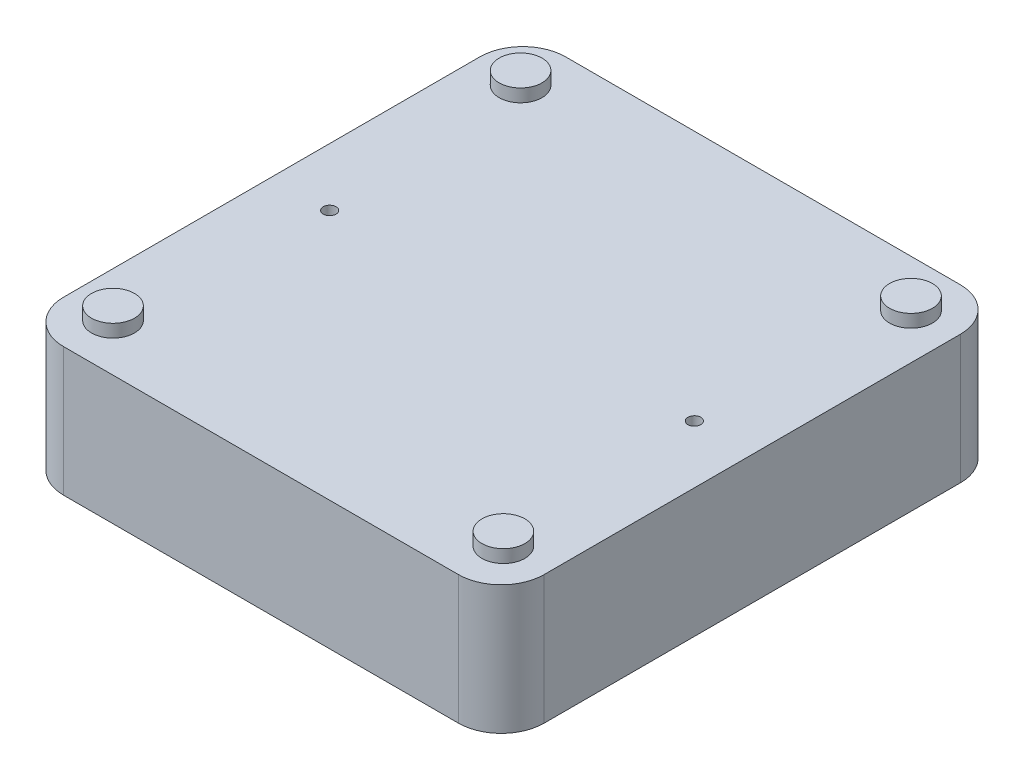
ISO-10303-21;
HEADER;
FILE_DESCRIPTION(('STEP AP214'),'2;1');
FILE_NAME('part.step','',(''),(''),'','','');
FILE_SCHEMA(('AUTOMOTIVE_DESIGN { 1 0 10303 214 1 1 1 1 }'));
ENDSEC;
DATA;
#1=APPLICATION_CONTEXT('core data for automotive mechanical design processes');
#2=APPLICATION_PROTOCOL_DEFINITION('international standard','automotive_design',2000,#1);
#3=PRODUCT_CONTEXT('',#1,'mechanical');
#4=PRODUCT('Part','Part','',(#3));
#5=PRODUCT_RELATED_PRODUCT_CATEGORY('part','',(#4));
#6=PRODUCT_DEFINITION_FORMATION('','',#4);
#7=PRODUCT_DEFINITION_CONTEXT('part definition',#1,'design');
#8=PRODUCT_DEFINITION('design','',#6,#7);
#9=PRODUCT_DEFINITION_SHAPE('','',#8);
#10=(LENGTH_UNIT() NAMED_UNIT(*) SI_UNIT(.MILLI.,.METRE.));
#11=(NAMED_UNIT(*) PLANE_ANGLE_UNIT() SI_UNIT($,.RADIAN.));
#12=(NAMED_UNIT(*) SI_UNIT($,.STERADIAN.) SOLID_ANGLE_UNIT());
#13=UNCERTAINTY_MEASURE_WITH_UNIT(LENGTH_MEASURE(1.E-05),#10,'distance_accuracy_value','');
#14=(GEOMETRIC_REPRESENTATION_CONTEXT(3) GLOBAL_UNCERTAINTY_ASSIGNED_CONTEXT((#13)) GLOBAL_UNIT_ASSIGNED_CONTEXT((#10,
#11,#12)) REPRESENTATION_CONTEXT('',''));
#15=CARTESIAN_POINT('',(0.,0.,0.));
#16=DIRECTION('',(0.,0.,1.));
#17=DIRECTION('',(1.,0.,0.));
#18=AXIS2_PLACEMENT_3D('',#15,#16,#17);
#19=CARTESIAN_POINT('',(56.,30.,58.5));
#20=DIRECTION('',(-1.,0.,0.));
#21=DIRECTION('',(0.,0.,1.));
#22=AXIS2_PLACEMENT_3D('',#19,#20,#21);
#23=PLANE('',#22);
#24=DIRECTION('',(0.,0.,-1.));
#25=VECTOR('',#24,1.);
#26=CARTESIAN_POINT('',(56.,0.,58.5));
#27=LINE('',#26,#25);
#28=CARTESIAN_POINT('',(56.,0.,48.5));
#29=VERTEX_POINT('',#28);
#30=CARTESIAN_POINT('',(56.,0.,-48.5));
#31=VERTEX_POINT('',#30);
#32=EDGE_CURVE('E138',#29,#31,#27,.T.);
#33=ORIENTED_EDGE('',*,*,#32,.T.);
#34=DIRECTION('',(0.,-1.,0.));
#35=VECTOR('',#34,1.);
#36=CARTESIAN_POINT('',(56.,30.,-48.5));
#37=LINE('',#36,#35);
#38=CARTESIAN_POINT('',(56.,30.,-48.5));
#39=VERTEX_POINT('',#38);
#40=EDGE_CURVE('E165',#31,#39,#37,.F.);
#41=ORIENTED_EDGE('',*,*,#40,.T.);
#42=DIRECTION('',(0.,0.,-1.));
#43=VECTOR('',#42,1.);
#44=CARTESIAN_POINT('',(56.,30.,58.5));
#45=LINE('',#44,#43);
#46=CARTESIAN_POINT('',(56.,30.,48.5));
#47=VERTEX_POINT('',#46);
#48=EDGE_CURVE('E136',#47,#39,#45,.T.);
#49=ORIENTED_EDGE('',*,*,#48,.F.);
#50=DIRECTION('',(0.,-1.,0.));
#51=VECTOR('',#50,1.);
#52=CARTESIAN_POINT('',(56.,30.,48.5));
#53=LINE('',#52,#51);
#54=EDGE_CURVE('E162',#47,#29,#53,.T.);
#55=ORIENTED_EDGE('',*,*,#54,.T.);
#56=EDGE_LOOP('',(#33,#41,#49,#55));
#57=FACE_BOUND('',#56,.T.);
#58=ADVANCED_FACE('F41',(#57),#23,.F.);
#59=CARTESIAN_POINT('',(-56.,30.,-58.5));
#60=DIRECTION('',(0.,0.,1.));
#61=DIRECTION('',(1.,0.,0.));
#62=AXIS2_PLACEMENT_3D('',#59,#60,#61);
#63=PLANE('',#62);
#64=DIRECTION('',(-1.,0.,0.));
#65=VECTOR('',#64,1.);
#66=CARTESIAN_POINT('',(-56.,0.,-58.5));
#67=LINE('',#66,#65);
#68=CARTESIAN_POINT('',(46.,0.,-58.5));
#69=VERTEX_POINT('',#68);
#70=CARTESIAN_POINT('',(-46.,0.,-58.5));
#71=VERTEX_POINT('',#70);
#72=EDGE_CURVE('E134',#69,#71,#67,.T.);
#73=ORIENTED_EDGE('',*,*,#72,.T.);
#74=DIRECTION('',(0.,-1.,0.));
#75=VECTOR('',#74,1.);
#76=CARTESIAN_POINT('',(-46.,30.,-58.5));
#77=LINE('',#76,#75);
#78=CARTESIAN_POINT('',(-46.,30.,-58.5));
#79=VERTEX_POINT('',#78);
#80=EDGE_CURVE('E113',#71,#79,#77,.F.);
#81=ORIENTED_EDGE('',*,*,#80,.T.);
#82=DIRECTION('',(-1.,0.,0.));
#83=VECTOR('',#82,1.);
#84=CARTESIAN_POINT('',(-56.,30.,-58.5));
#85=LINE('',#84,#83);
#86=CARTESIAN_POINT('',(46.,30.,-58.5));
#87=VERTEX_POINT('',#86);
#88=EDGE_CURVE('E188',#87,#79,#85,.T.);
#89=ORIENTED_EDGE('',*,*,#88,.F.);
#90=DIRECTION('',(0.,-1.,0.));
#91=VECTOR('',#90,1.);
#92=CARTESIAN_POINT('',(46.,30.,-58.5));
#93=LINE('',#92,#91);
#94=EDGE_CURVE('E118',#87,#69,#93,.T.);
#95=ORIENTED_EDGE('',*,*,#94,.T.);
#96=EDGE_LOOP('',(#73,#81,#89,#95));
#97=FACE_BOUND('',#96,.T.);
#98=ADVANCED_FACE('F260',(#97),#63,.F.);
#99=CARTESIAN_POINT('',(-56.,30.,58.5));
#100=DIRECTION('',(1.,0.,0.));
#101=DIRECTION('',(0.,0.,-1.));
#102=AXIS2_PLACEMENT_3D('',#99,#100,#101);
#103=PLANE('',#102);
#104=DIRECTION('',(0.,0.,1.));
#105=VECTOR('',#104,1.);
#106=CARTESIAN_POINT('',(-56.,30.,58.5));
#107=LINE('',#106,#105);
#108=CARTESIAN_POINT('',(-56.,30.,-48.5));
#109=VERTEX_POINT('',#108);
#110=CARTESIAN_POINT('',(-56.,30.,48.5));
#111=VERTEX_POINT('',#110);
#112=EDGE_CURVE('E127',#109,#111,#107,.T.);
#113=ORIENTED_EDGE('',*,*,#112,.F.);
#114=DIRECTION('',(0.,-1.,0.));
#115=VECTOR('',#114,1.);
#116=CARTESIAN_POINT('',(-56.,30.,-48.5));
#117=LINE('',#116,#115);
#118=CARTESIAN_POINT('',(-56.,0.,-48.5));
#119=VERTEX_POINT('',#118);
#120=EDGE_CURVE('E112',#109,#119,#117,.T.);
#121=ORIENTED_EDGE('',*,*,#120,.T.);
#122=DIRECTION('',(0.,0.,1.));
#123=VECTOR('',#122,1.);
#124=CARTESIAN_POINT('',(-56.,0.,58.5));
#125=LINE('',#124,#123);
#126=CARTESIAN_POINT('',(-56.,0.,48.5));
#127=VERTEX_POINT('',#126);
#128=EDGE_CURVE('E125',#119,#127,#125,.T.);
#129=ORIENTED_EDGE('',*,*,#128,.T.);
#130=DIRECTION('',(0.,-1.,0.));
#131=VECTOR('',#130,1.);
#132=CARTESIAN_POINT('',(-56.,30.,48.5));
#133=LINE('',#132,#131);
#134=EDGE_CURVE('E129',#127,#111,#133,.F.);
#135=ORIENTED_EDGE('',*,*,#134,.T.);
#136=EDGE_LOOP('',(#113,#121,#129,#135));
#137=FACE_BOUND('',#136,.T.);
#138=ADVANCED_FACE('F124',(#137),#103,.F.);
#139=CARTESIAN_POINT('',(-56.,30.,58.5));
#140=DIRECTION('',(0.,0.,-1.));
#141=DIRECTION('',(-1.,0.,0.));
#142=AXIS2_PLACEMENT_3D('',#139,#140,#141);
#143=PLANE('',#142);
#144=DIRECTION('',(1.,0.,0.));
#145=VECTOR('',#144,1.);
#146=CARTESIAN_POINT('',(-56.,30.,58.5));
#147=LINE('',#146,#145);
#148=CARTESIAN_POINT('',(-46.,30.,58.5));
#149=VERTEX_POINT('',#148);
#150=CARTESIAN_POINT('',(46.,30.,58.5));
#151=VERTEX_POINT('',#150);
#152=EDGE_CURVE('E142',#149,#151,#147,.T.);
#153=ORIENTED_EDGE('',*,*,#152,.F.);
#154=DIRECTION('',(0.,-1.,0.));
#155=VECTOR('',#154,1.);
#156=CARTESIAN_POINT('',(-46.,30.,58.5));
#157=LINE('',#156,#155);
#158=CARTESIAN_POINT('',(-46.,0.,58.5));
#159=VERTEX_POINT('',#158);
#160=EDGE_CURVE('E159',#149,#159,#157,.T.);
#161=ORIENTED_EDGE('',*,*,#160,.T.);
#162=DIRECTION('',(1.,0.,0.));
#163=VECTOR('',#162,1.);
#164=CARTESIAN_POINT('',(-56.,0.,58.5));
#165=LINE('',#164,#163);
#166=CARTESIAN_POINT('',(46.,0.,58.5));
#167=VERTEX_POINT('',#166);
#168=EDGE_CURVE('E133',#159,#167,#165,.T.);
#169=ORIENTED_EDGE('',*,*,#168,.T.);
#170=DIRECTION('',(0.,-1.,0.));
#171=VECTOR('',#170,1.);
#172=CARTESIAN_POINT('',(46.,30.,58.5));
#173=LINE('',#172,#171);
#174=EDGE_CURVE('E56',#167,#151,#173,.F.);
#175=ORIENTED_EDGE('',*,*,#174,.T.);
#176=EDGE_LOOP('',(#153,#161,#169,#175));
#177=FACE_BOUND('',#176,.T.);
#178=ADVANCED_FACE('F180',(#177),#143,.F.);
#179=CARTESIAN_POINT('',(0.,30.,0.));
#180=DIRECTION('',(0.,-1.,0.));
#181=DIRECTION('',(0.,0.,-1.));
#182=AXIS2_PLACEMENT_3D('',#179,#180,#181);
#183=PLANE('',#182);
#184=CARTESIAN_POINT('',(-42.5,30.,0.));
#185=DIRECTION('',(0.,1.,0.));
#186=DIRECTION('',(0.,0.,1.));
#187=AXIS2_PLACEMENT_3D('',#184,#185,#186);
#188=CIRCLE('',#187,1.5);
#189=CARTESIAN_POINT('',(-42.5,30.,1.5));
#190=VERTEX_POINT('',#189);
#191=EDGE_CURVE('E223',#190,#190,#188,.T.);
#192=ORIENTED_EDGE('',*,*,#191,.F.);
#193=EDGE_LOOP('',(#192));
#194=FACE_BOUND('',#193,.T.);
#195=CARTESIAN_POINT('',(42.5,30.,0.));
#196=DIRECTION('',(0.,1.,0.));
#197=DIRECTION('',(0.,0.,1.));
#198=AXIS2_PLACEMENT_3D('',#195,#196,#197);
#199=CIRCLE('',#198,1.5);
#200=CARTESIAN_POINT('',(42.5,30.,1.49999999999999));
#201=VERTEX_POINT('',#200);
#202=EDGE_CURVE('E220',#201,#201,#199,.T.);
#203=ORIENTED_EDGE('',*,*,#202,.F.);
#204=EDGE_LOOP('',(#203));
#205=FACE_BOUND('',#204,.T.);
#206=CARTESIAN_POINT('',(45.5,30.,47.5));
#207=DIRECTION('',(0.,-1.,0.));
#208=DIRECTION('',(0.,0.,-1.));
#209=AXIS2_PLACEMENT_3D('',#206,#207,#208);
#210=CIRCLE('',#209,5.);
#211=CARTESIAN_POINT('',(45.5,30.,42.5));
#212=VERTEX_POINT('',#211);
#213=EDGE_CURVE('E11',#212,#212,#210,.F.);
#214=ORIENTED_EDGE('',*,*,#213,.F.);
#215=EDGE_LOOP('',(#214));
#216=FACE_BOUND('',#215,.T.);
#217=CARTESIAN_POINT('',(-45.5,30.,47.5));
#218=DIRECTION('',(0.,-1.,0.));
#219=DIRECTION('',(0.,0.,-1.));
#220=AXIS2_PLACEMENT_3D('',#217,#218,#219);
#221=CIRCLE('',#220,5.);
#222=CARTESIAN_POINT('',(-45.5,30.,42.5));
#223=VERTEX_POINT('',#222);
#224=EDGE_CURVE('E49',#223,#223,#221,.F.);
#225=ORIENTED_EDGE('',*,*,#224,.F.);
#226=EDGE_LOOP('',(#225));
#227=FACE_BOUND('',#226,.T.);
#228=CARTESIAN_POINT('',(45.5,30.,-47.5));
#229=DIRECTION('',(0.,-1.,0.));
#230=DIRECTION('',(0.,0.,-1.));
#231=AXIS2_PLACEMENT_3D('',#228,#229,#230);
#232=CIRCLE('',#231,5.);
#233=CARTESIAN_POINT('',(45.5,30.,-52.5));
#234=VERTEX_POINT('',#233);
#235=EDGE_CURVE('E170',#234,#234,#232,.F.);
#236=ORIENTED_EDGE('',*,*,#235,.F.);
#237=EDGE_LOOP('',(#236));
#238=FACE_BOUND('',#237,.T.);
#239=CARTESIAN_POINT('',(-45.5,30.,-47.5));
#240=DIRECTION('',(0.,-1.,0.));
#241=DIRECTION('',(0.,0.,-1.));
#242=AXIS2_PLACEMENT_3D('',#239,#240,#241);
#243=CIRCLE('',#242,5.);
#244=CARTESIAN_POINT('',(-45.5,30.,-52.5));
#245=VERTEX_POINT('',#244);
#246=EDGE_CURVE('E167',#245,#245,#243,.F.);
#247=ORIENTED_EDGE('',*,*,#246,.F.);
#248=EDGE_LOOP('',(#247));
#249=FACE_BOUND('',#248,.T.);
#250=ORIENTED_EDGE('',*,*,#88,.T.);
#251=CARTESIAN_POINT('',(-46.,30.,-48.5));
#252=DIRECTION('',(0.,-1.,0.));
#253=DIRECTION('',(0.,0.,-1.));
#254=AXIS2_PLACEMENT_3D('',#251,#252,#253);
#255=CIRCLE('',#254,10.);
#256=EDGE_CURVE('E156',#79,#109,#255,.F.);
#257=ORIENTED_EDGE('',*,*,#256,.T.);
#258=ORIENTED_EDGE('',*,*,#112,.T.);
#259=CARTESIAN_POINT('',(-46.,30.,48.5));
#260=DIRECTION('',(0.,-1.,0.));
#261=DIRECTION('',(0.,0.,-1.));
#262=AXIS2_PLACEMENT_3D('',#259,#260,#261);
#263=CIRCLE('',#262,10.);
#264=EDGE_CURVE('E63',#111,#149,#263,.F.);
#265=ORIENTED_EDGE('',*,*,#264,.T.);
#266=ORIENTED_EDGE('',*,*,#152,.T.);
#267=CARTESIAN_POINT('',(46.,30.,48.5));
#268=DIRECTION('',(0.,-1.,0.));
#269=DIRECTION('',(0.,0.,-1.));
#270=AXIS2_PLACEMENT_3D('',#267,#268,#269);
#271=CIRCLE('',#270,10.);
#272=EDGE_CURVE('E151',#151,#47,#271,.F.);
#273=ORIENTED_EDGE('',*,*,#272,.T.);
#274=ORIENTED_EDGE('',*,*,#48,.T.);
#275=CARTESIAN_POINT('',(46.,30.,-48.5));
#276=DIRECTION('',(0.,-1.,0.));
#277=DIRECTION('',(0.,0.,-1.));
#278=AXIS2_PLACEMENT_3D('',#275,#276,#277);
#279=CIRCLE('',#278,10.);
#280=EDGE_CURVE('E153',#39,#87,#279,.F.);
#281=ORIENTED_EDGE('',*,*,#280,.T.);
#282=EDGE_LOOP('',(#250,#257,#258,#265,#266,#273,#274,#281));
#283=FACE_BOUND('',#282,.T.);
#284=ADVANCED_FACE('F177',(#194,#205,#216,#227,#238,#249,#283),#183,.F.);
#285=CARTESIAN_POINT('',(0.,0.,0.));
#286=DIRECTION('',(0.,-1.,0.));
#287=DIRECTION('',(0.,0.,-1.));
#288=AXIS2_PLACEMENT_3D('',#285,#286,#287);
#289=PLANE('',#288);
#290=ORIENTED_EDGE('',*,*,#128,.F.);
#291=CARTESIAN_POINT('',(-46.,0.,-48.5));
#292=DIRECTION('',(0.,-1.,0.));
#293=DIRECTION('',(0.,0.,-1.));
#294=AXIS2_PLACEMENT_3D('',#291,#292,#293);
#295=CIRCLE('',#294,10.);
#296=EDGE_CURVE('E108',#119,#71,#295,.T.);
#297=ORIENTED_EDGE('',*,*,#296,.T.);
#298=ORIENTED_EDGE('',*,*,#72,.F.);
#299=CARTESIAN_POINT('',(46.,0.,-48.5));
#300=DIRECTION('',(0.,-1.,0.));
#301=DIRECTION('',(0.,0.,-1.));
#302=AXIS2_PLACEMENT_3D('',#299,#300,#301);
#303=CIRCLE('',#302,10.);
#304=EDGE_CURVE('E145',#69,#31,#303,.T.);
#305=ORIENTED_EDGE('',*,*,#304,.T.);
#306=ORIENTED_EDGE('',*,*,#32,.F.);
#307=CARTESIAN_POINT('',(46.,0.,48.5));
#308=DIRECTION('',(0.,-1.,0.));
#309=DIRECTION('',(0.,0.,-1.));
#310=AXIS2_PLACEMENT_3D('',#307,#308,#309);
#311=CIRCLE('',#310,10.);
#312=EDGE_CURVE('E128',#29,#167,#311,.T.);
#313=ORIENTED_EDGE('',*,*,#312,.T.);
#314=ORIENTED_EDGE('',*,*,#168,.F.);
#315=CARTESIAN_POINT('',(-46.,0.,48.5));
#316=DIRECTION('',(0.,-1.,0.));
#317=DIRECTION('',(0.,0.,-1.));
#318=AXIS2_PLACEMENT_3D('',#315,#316,#317);
#319=CIRCLE('',#318,10.);
#320=EDGE_CURVE('E119',#159,#127,#319,.T.);
#321=ORIENTED_EDGE('',*,*,#320,.T.);
#322=EDGE_LOOP('',(#290,#297,#298,#305,#306,#313,#314,#321));
#323=FACE_BOUND('',#322,.T.);
#324=ADVANCED_FACE('F131',(#323),#289,.T.);
#325=CARTESIAN_POINT('',(-46.,30.,-48.5));
#326=DIRECTION('',(0.,-1.,0.));
#327=DIRECTION('',(0.,0.,-1.));
#328=AXIS2_PLACEMENT_3D('',#325,#326,#327);
#329=CYLINDRICAL_SURFACE('',#328,10.);
#330=ORIENTED_EDGE('',*,*,#256,.F.);
#331=ORIENTED_EDGE('',*,*,#80,.F.);
#332=ORIENTED_EDGE('',*,*,#296,.F.);
#333=ORIENTED_EDGE('',*,*,#120,.F.);
#334=EDGE_LOOP('',(#330,#331,#332,#333));
#335=FACE_BOUND('',#334,.T.);
#336=ADVANCED_FACE('F111',(#335),#329,.T.);
#337=CARTESIAN_POINT('',(-46.,30.,48.5));
#338=DIRECTION('',(0.,-1.,0.));
#339=DIRECTION('',(0.,0.,-1.));
#340=AXIS2_PLACEMENT_3D('',#337,#338,#339);
#341=CYLINDRICAL_SURFACE('',#340,10.);
#342=ORIENTED_EDGE('',*,*,#264,.F.);
#343=ORIENTED_EDGE('',*,*,#134,.F.);
#344=ORIENTED_EDGE('',*,*,#320,.F.);
#345=ORIENTED_EDGE('',*,*,#160,.F.);
#346=EDGE_LOOP('',(#342,#343,#344,#345));
#347=FACE_BOUND('',#346,.T.);
#348=ADVANCED_FACE('F270',(#347),#341,.T.);
#349=CARTESIAN_POINT('',(46.,30.,-48.5));
#350=DIRECTION('',(0.,-1.,0.));
#351=DIRECTION('',(0.,0.,-1.));
#352=AXIS2_PLACEMENT_3D('',#349,#350,#351);
#353=CYLINDRICAL_SURFACE('',#352,10.);
#354=ORIENTED_EDGE('',*,*,#280,.F.);
#355=ORIENTED_EDGE('',*,*,#40,.F.);
#356=ORIENTED_EDGE('',*,*,#304,.F.);
#357=ORIENTED_EDGE('',*,*,#94,.F.);
#358=EDGE_LOOP('',(#354,#355,#356,#357));
#359=FACE_BOUND('',#358,.T.);
#360=ADVANCED_FACE('F272',(#359),#353,.T.);
#361=CARTESIAN_POINT('',(46.,30.,48.5));
#362=DIRECTION('',(0.,-1.,0.));
#363=DIRECTION('',(0.,0.,-1.));
#364=AXIS2_PLACEMENT_3D('',#361,#362,#363);
#365=CYLINDRICAL_SURFACE('',#364,10.);
#366=ORIENTED_EDGE('',*,*,#272,.F.);
#367=ORIENTED_EDGE('',*,*,#174,.F.);
#368=ORIENTED_EDGE('',*,*,#312,.F.);
#369=ORIENTED_EDGE('',*,*,#54,.F.);
#370=EDGE_LOOP('',(#366,#367,#368,#369));
#371=FACE_BOUND('',#370,.T.);
#372=ADVANCED_FACE('F43',(#371),#365,.T.);
#373=CARTESIAN_POINT('',(-45.5,33.,-47.5));
#374=DIRECTION('',(0.,-1.,0.));
#375=DIRECTION('',(0.,0.,-1.));
#376=AXIS2_PLACEMENT_3D('',#373,#374,#375);
#377=CYLINDRICAL_SURFACE('',#376,5.);
#378=CARTESIAN_POINT('',(-45.5,33.,-47.5));
#379=DIRECTION('',(0.,1.,0.));
#380=DIRECTION('',(0.,0.,1.));
#381=AXIS2_PLACEMENT_3D('',#378,#379,#380);
#382=CIRCLE('',#381,5.);
#383=CARTESIAN_POINT('',(-45.5,33.,-42.5));
#384=VERTEX_POINT('',#383);
#385=EDGE_CURVE('E199',#384,#384,#382,.T.);
#386=ORIENTED_EDGE('',*,*,#385,.F.);
#387=EDGE_LOOP('',(#386));
#388=FACE_BOUND('',#387,.T.);
#389=ORIENTED_EDGE('',*,*,#246,.T.);
#390=EDGE_LOOP('',(#389));
#391=FACE_BOUND('',#390,.T.);
#392=ADVANCED_FACE('F279',(#388,#391),#377,.T.);
#393=CARTESIAN_POINT('',(-45.5,33.,-47.5));
#394=DIRECTION('',(0.,1.,0.));
#395=DIRECTION('',(0.,0.,1.));
#396=AXIS2_PLACEMENT_3D('',#393,#394,#395);
#397=PLANE('',#396);
#398=ORIENTED_EDGE('',*,*,#385,.T.);
#399=EDGE_LOOP('',(#398));
#400=FACE_BOUND('',#399,.T.);
#401=ADVANCED_FACE('F295',(#400),#397,.T.);
#402=CARTESIAN_POINT('',(45.5,33.,-47.5));
#403=DIRECTION('',(0.,-1.,0.));
#404=DIRECTION('',(0.,0.,-1.));
#405=AXIS2_PLACEMENT_3D('',#402,#403,#404);
#406=CYLINDRICAL_SURFACE('',#405,5.);
#407=CARTESIAN_POINT('',(45.5,33.,-47.5));
#408=DIRECTION('',(0.,1.,0.));
#409=DIRECTION('',(0.,0.,1.));
#410=AXIS2_PLACEMENT_3D('',#407,#408,#409);
#411=CIRCLE('',#410,5.);
#412=CARTESIAN_POINT('',(45.5,33.,-42.5));
#413=VERTEX_POINT('',#412);
#414=EDGE_CURVE('E204',#413,#413,#411,.T.);
#415=ORIENTED_EDGE('',*,*,#414,.F.);
#416=EDGE_LOOP('',(#415));
#417=FACE_BOUND('',#416,.T.);
#418=ORIENTED_EDGE('',*,*,#235,.T.);
#419=EDGE_LOOP('',(#418));
#420=FACE_BOUND('',#419,.T.);
#421=ADVANCED_FACE('F299',(#417,#420),#406,.T.);
#422=CARTESIAN_POINT('',(45.5,33.,-47.5));
#423=DIRECTION('',(0.,1.,0.));
#424=DIRECTION('',(0.,0.,1.));
#425=AXIS2_PLACEMENT_3D('',#422,#423,#424);
#426=PLANE('',#425);
#427=ORIENTED_EDGE('',*,*,#414,.T.);
#428=EDGE_LOOP('',(#427));
#429=FACE_BOUND('',#428,.T.);
#430=ADVANCED_FACE('F300',(#429),#426,.T.);
#431=CARTESIAN_POINT('',(-45.5,33.,47.5));
#432=DIRECTION('',(0.,-1.,0.));
#433=DIRECTION('',(0.,0.,-1.));
#434=AXIS2_PLACEMENT_3D('',#431,#432,#433);
#435=CYLINDRICAL_SURFACE('',#434,5.);
#436=CARTESIAN_POINT('',(-45.5,33.,47.5));
#437=DIRECTION('',(0.,1.,0.));
#438=DIRECTION('',(0.,0.,1.));
#439=AXIS2_PLACEMENT_3D('',#436,#437,#438);
#440=CIRCLE('',#439,5.);
#441=CARTESIAN_POINT('',(-45.5,33.,52.5));
#442=VERTEX_POINT('',#441);
#443=EDGE_CURVE('E208',#442,#442,#440,.T.);
#444=ORIENTED_EDGE('',*,*,#443,.F.);
#445=EDGE_LOOP('',(#444));
#446=FACE_BOUND('',#445,.T.);
#447=ORIENTED_EDGE('',*,*,#224,.T.);
#448=EDGE_LOOP('',(#447));
#449=FACE_BOUND('',#448,.T.);
#450=ADVANCED_FACE('F175',(#446,#449),#435,.T.);
#451=CARTESIAN_POINT('',(-45.5,33.,47.5));
#452=DIRECTION('',(0.,1.,0.));
#453=DIRECTION('',(0.,0.,1.));
#454=AXIS2_PLACEMENT_3D('',#451,#452,#453);
#455=PLANE('',#454);
#456=ORIENTED_EDGE('',*,*,#443,.T.);
#457=EDGE_LOOP('',(#456));
#458=FACE_BOUND('',#457,.T.);
#459=ADVANCED_FACE('F245',(#458),#455,.T.);
#460=CARTESIAN_POINT('',(45.5,33.,47.5));
#461=DIRECTION('',(0.,-1.,0.));
#462=DIRECTION('',(0.,0.,-1.));
#463=AXIS2_PLACEMENT_3D('',#460,#461,#462);
#464=CYLINDRICAL_SURFACE('',#463,5.);
#465=CARTESIAN_POINT('',(45.5,33.,47.5));
#466=DIRECTION('',(0.,1.,0.));
#467=DIRECTION('',(0.,0.,1.));
#468=AXIS2_PLACEMENT_3D('',#465,#466,#467);
#469=CIRCLE('',#468,5.);
#470=CARTESIAN_POINT('',(45.5,33.,52.5));
#471=VERTEX_POINT('',#470);
#472=EDGE_CURVE('E213',#471,#471,#469,.T.);
#473=ORIENTED_EDGE('',*,*,#472,.F.);
#474=EDGE_LOOP('',(#473));
#475=FACE_BOUND('',#474,.T.);
#476=ORIENTED_EDGE('',*,*,#213,.T.);
#477=EDGE_LOOP('',(#476));
#478=FACE_BOUND('',#477,.T.);
#479=ADVANCED_FACE('F242',(#475,#478),#464,.T.);
#480=CARTESIAN_POINT('',(45.5,33.,47.5));
#481=DIRECTION('',(0.,1.,0.));
#482=DIRECTION('',(0.,0.,1.));
#483=AXIS2_PLACEMENT_3D('',#480,#481,#482);
#484=PLANE('',#483);
#485=ORIENTED_EDGE('',*,*,#472,.T.);
#486=EDGE_LOOP('',(#485));
#487=FACE_BOUND('',#486,.T.);
#488=ADVANCED_FACE('F244',(#487),#484,.T.);
#489=CARTESIAN_POINT('',(42.5,25.,0.));
#490=DIRECTION('',(0.,1.,0.));
#491=DIRECTION('',(0.,0.,1.));
#492=AXIS2_PLACEMENT_3D('',#489,#490,#491);
#493=CYLINDRICAL_SURFACE('',#492,1.5);
#494=CARTESIAN_POINT('',(42.5,25.,0.));
#495=DIRECTION('',(0.,1.,0.));
#496=DIRECTION('',(0.,0.,1.));
#497=AXIS2_PLACEMENT_3D('',#494,#495,#496);
#498=CIRCLE('',#497,1.5);
#499=CARTESIAN_POINT('',(42.5,25.,1.49999999999999));
#500=VERTEX_POINT('',#499);
#501=EDGE_CURVE('E217',#500,#500,#498,.T.);
#502=ORIENTED_EDGE('',*,*,#501,.F.);
#503=EDGE_LOOP('',(#502));
#504=FACE_BOUND('',#503,.T.);
#505=ORIENTED_EDGE('',*,*,#202,.T.);
#506=EDGE_LOOP('',(#505));
#507=FACE_BOUND('',#506,.T.);
#508=ADVANCED_FACE('F252',(#504,#507),#493,.F.);
#509=CARTESIAN_POINT('',(42.5,25.,0.));
#510=DIRECTION('',(0.,1.,0.));
#511=DIRECTION('',(0.,0.,1.));
#512=AXIS2_PLACEMENT_3D('',#509,#510,#511);
#513=PLANE('',#512);
#514=ORIENTED_EDGE('',*,*,#501,.T.);
#515=EDGE_LOOP('',(#514));
#516=FACE_BOUND('',#515,.T.);
#517=ADVANCED_FACE('F234',(#516),#513,.T.);
#518=CARTESIAN_POINT('',(-42.5,25.,0.));
#519=DIRECTION('',(0.,1.,0.));
#520=DIRECTION('',(0.,0.,1.));
#521=AXIS2_PLACEMENT_3D('',#518,#519,#520);
#522=CYLINDRICAL_SURFACE('',#521,1.5);
#523=CARTESIAN_POINT('',(-42.5,25.,0.));
#524=DIRECTION('',(0.,1.,0.));
#525=DIRECTION('',(0.,0.,1.));
#526=AXIS2_PLACEMENT_3D('',#523,#524,#525);
#527=CIRCLE('',#526,1.5);
#528=CARTESIAN_POINT('',(-42.5,25.,1.5));
#529=VERTEX_POINT('',#528);
#530=EDGE_CURVE('E216',#529,#529,#527,.T.);
#531=ORIENTED_EDGE('',*,*,#530,.F.);
#532=EDGE_LOOP('',(#531));
#533=FACE_BOUND('',#532,.T.);
#534=ORIENTED_EDGE('',*,*,#191,.T.);
#535=EDGE_LOOP('',(#534));
#536=FACE_BOUND('',#535,.T.);
#537=ADVANCED_FACE('F231',(#533,#536),#522,.F.);
#538=CARTESIAN_POINT('',(-42.5,25.,0.));
#539=DIRECTION('',(0.,1.,0.));
#540=DIRECTION('',(0.,0.,1.));
#541=AXIS2_PLACEMENT_3D('',#538,#539,#540);
#542=PLANE('',#541);
#543=ORIENTED_EDGE('',*,*,#530,.T.);
#544=EDGE_LOOP('',(#543));
#545=FACE_BOUND('',#544,.T.);
#546=ADVANCED_FACE('F229',(#545),#542,.T.);
#547=CLOSED_SHELL('',(#58,#98,#138,#178,#284,#324,#336,#348,#360,#372,#392,#401,#421,#430,#450,
#459,#479,#488,#508,#517,#537,#546));
#548=MANIFOLD_SOLID_BREP('B2',#547);
#549=ADVANCED_BREP_SHAPE_REPRESENTATION('',(#18,#548),#14);
#550=SHAPE_DEFINITION_REPRESENTATION(#9,#549);
ENDSEC;
END-ISO-10303-21;
